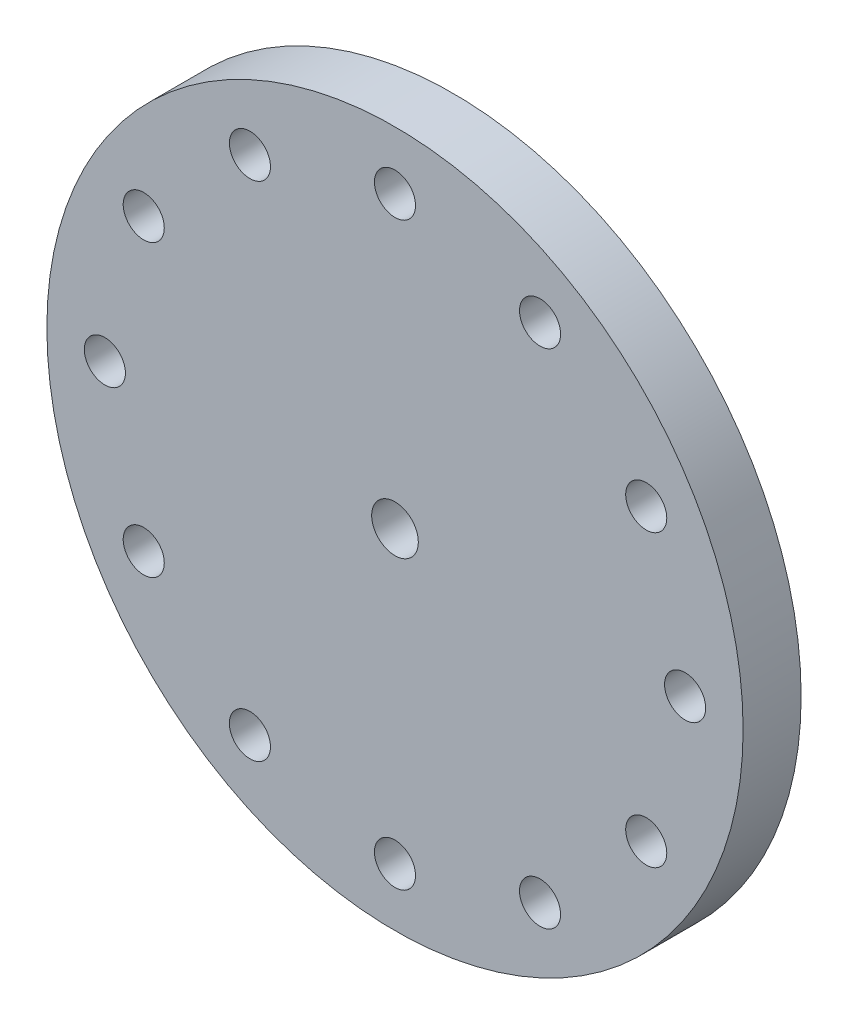
ISO-10303-21;
HEADER;
FILE_DESCRIPTION(('STEP AP214'),'2;1');
FILE_NAME('part.step','',(''),(''),'','','');
FILE_SCHEMA(('AUTOMOTIVE_DESIGN { 1 0 10303 214 1 1 1 1 }'));
ENDSEC;
DATA;
#1=APPLICATION_CONTEXT('core data for automotive mechanical design processes');
#2=APPLICATION_PROTOCOL_DEFINITION('international standard','automotive_design',2000,#1);
#3=PRODUCT_CONTEXT('',#1,'mechanical');
#4=PRODUCT('Part','Part','',(#3));
#5=PRODUCT_RELATED_PRODUCT_CATEGORY('part','',(#4));
#6=PRODUCT_DEFINITION_FORMATION('','',#4);
#7=PRODUCT_DEFINITION_CONTEXT('part definition',#1,'design');
#8=PRODUCT_DEFINITION('design','',#6,#7);
#9=PRODUCT_DEFINITION_SHAPE('','',#8);
#10=(LENGTH_UNIT() NAMED_UNIT(*) SI_UNIT(.MILLI.,.METRE.));
#11=(NAMED_UNIT(*) PLANE_ANGLE_UNIT() SI_UNIT($,.RADIAN.));
#12=(NAMED_UNIT(*) SI_UNIT($,.STERADIAN.) SOLID_ANGLE_UNIT());
#13=UNCERTAINTY_MEASURE_WITH_UNIT(LENGTH_MEASURE(1.E-05),#10,'distance_accuracy_value','');
#14=(GEOMETRIC_REPRESENTATION_CONTEXT(3) GLOBAL_UNCERTAINTY_ASSIGNED_CONTEXT((#13)) GLOBAL_UNIT_ASSIGNED_CONTEXT((#10,
#11,#12)) REPRESENTATION_CONTEXT('',''));
#15=CARTESIAN_POINT('',(0.,0.,0.));
#16=DIRECTION('',(0.,0.,1.));
#17=DIRECTION('',(1.,0.,0.));
#18=AXIS2_PLACEMENT_3D('',#15,#16,#17);
#19=CARTESIAN_POINT('',(0.,0.,6.35));
#20=DIRECTION('',(0.,0.,-1.));
#21=DIRECTION('',(-1.,0.,0.));
#22=AXIS2_PLACEMENT_3D('',#19,#20,#21);
#23=CYLINDRICAL_SURFACE('',#22,38.1);
#24=CARTESIAN_POINT('',(0.,0.,6.35));
#25=DIRECTION('',(0.,0.,1.));
#26=DIRECTION('',(1.,0.,0.));
#27=AXIS2_PLACEMENT_3D('',#24,#25,#26);
#28=CIRCLE('',#27,38.1);
#29=CARTESIAN_POINT('',(38.1,0.,6.35));
#30=VERTEX_POINT('',#29);
#31=EDGE_CURVE('E10',#30,#30,#28,.T.);
#32=ORIENTED_EDGE('',*,*,#31,.F.);
#33=EDGE_LOOP('',(#32));
#34=FACE_BOUND('',#33,.T.);
#35=CARTESIAN_POINT('',(0.,0.,0.));
#36=DIRECTION('',(0.,0.,1.));
#37=DIRECTION('',(1.,0.,0.));
#38=AXIS2_PLACEMENT_3D('',#35,#36,#37);
#39=CIRCLE('',#38,38.1);
#40=CARTESIAN_POINT('',(38.1,0.,0.));
#41=VERTEX_POINT('',#40);
#42=EDGE_CURVE('E48',#41,#41,#39,.T.);
#43=ORIENTED_EDGE('',*,*,#42,.T.);
#44=EDGE_LOOP('',(#43));
#45=FACE_BOUND('',#44,.T.);
#46=ADVANCED_FACE('F41',(#34,#45),#23,.T.);
#47=CARTESIAN_POINT('',(0.,0.,6.35));
#48=DIRECTION('',(0.,0.,1.));
#49=DIRECTION('',(1.,0.,0.));
#50=AXIS2_PLACEMENT_3D('',#47,#48,#49);
#51=PLANE('',#50);
#52=CARTESIAN_POINT('',(-31.75,0.,6.35));
#53=DIRECTION('',(0.,0.,1.));
#54=DIRECTION('',(1.,0.,0.));
#55=AXIS2_PLACEMENT_3D('',#52,#53,#54);
#56=CIRCLE('',#55,2.24789999999996);
#57=CARTESIAN_POINT('',(-29.5021,0.,6.35));
#58=VERTEX_POINT('',#57);
#59=EDGE_CURVE('E162',#58,#58,#56,.T.);
#60=ORIENTED_EDGE('',*,*,#59,.F.);
#61=EDGE_LOOP('',(#60));
#62=FACE_BOUND('',#61,.T.);
#63=CARTESIAN_POINT('',(-27.4963065701559,15.875,6.35));
#64=DIRECTION('',(0.,0.,1.));
#65=DIRECTION('',(1.,0.,0.));
#66=AXIS2_PLACEMENT_3D('',#63,#64,#65);
#67=CIRCLE('',#66,2.24789999999996);
#68=CARTESIAN_POINT('',(-25.2484065701559,15.875,6.35));
#69=VERTEX_POINT('',#68);
#70=EDGE_CURVE('E86',#69,#69,#67,.T.);
#71=ORIENTED_EDGE('',*,*,#70,.F.);
#72=EDGE_LOOP('',(#71));
#73=FACE_BOUND('',#72,.T.);
#74=CARTESIAN_POINT('',(-15.8749999999999,27.496306570156,6.35));
#75=DIRECTION('',(0.,0.,1.));
#76=DIRECTION('',(1.,0.,0.));
#77=AXIS2_PLACEMENT_3D('',#74,#75,#76);
#78=CIRCLE('',#77,2.24789999999996);
#79=CARTESIAN_POINT('',(-13.6271,27.496306570156,6.35));
#80=VERTEX_POINT('',#79);
#81=EDGE_CURVE('E74',#80,#80,#78,.T.);
#82=ORIENTED_EDGE('',*,*,#81,.F.);
#83=EDGE_LOOP('',(#82));
#84=FACE_BOUND('',#83,.T.);
#85=CARTESIAN_POINT('',(1.10854532508269E-13,31.75,6.35));
#86=DIRECTION('',(0.,0.,1.));
#87=DIRECTION('',(1.,0.,0.));
#88=AXIS2_PLACEMENT_3D('',#85,#86,#87);
#89=CIRCLE('',#88,2.24789999999996);
#90=CARTESIAN_POINT('',(2.24790000000007,31.75,6.35));
#91=VERTEX_POINT('',#90);
#92=EDGE_CURVE('E73',#91,#91,#89,.T.);
#93=ORIENTED_EDGE('',*,*,#92,.F.);
#94=EDGE_LOOP('',(#93));
#95=FACE_BOUND('',#94,.T.);
#96=CARTESIAN_POINT('',(15.8750000000001,27.4963065701559,6.35));
#97=DIRECTION('',(0.,0.,1.));
#98=DIRECTION('',(1.,0.,0.));
#99=AXIS2_PLACEMENT_3D('',#96,#97,#98);
#100=CIRCLE('',#99,2.24789999999996);
#101=CARTESIAN_POINT('',(18.1229000000001,27.4963065701559,6.35));
#102=VERTEX_POINT('',#101);
#103=EDGE_CURVE('E70',#102,#102,#100,.T.);
#104=ORIENTED_EDGE('',*,*,#103,.F.);
#105=EDGE_LOOP('',(#104));
#106=FACE_BOUND('',#105,.T.);
#107=CARTESIAN_POINT('',(27.496306570156,15.8749999999998,6.35));
#108=DIRECTION('',(0.,0.,1.));
#109=DIRECTION('',(1.,0.,0.));
#110=AXIS2_PLACEMENT_3D('',#107,#108,#109);
#111=CIRCLE('',#110,2.24789999999996);
#112=CARTESIAN_POINT('',(29.744206570156,15.8749999999998,6.35));
#113=VERTEX_POINT('',#112);
#114=EDGE_CURVE('E67',#113,#113,#111,.T.);
#115=ORIENTED_EDGE('',*,*,#114,.F.);
#116=EDGE_LOOP('',(#115));
#117=FACE_BOUND('',#116,.T.);
#118=CARTESIAN_POINT('',(31.75,-2.21709065016539E-13,6.35));
#119=DIRECTION('',(0.,0.,1.));
#120=DIRECTION('',(1.,0.,0.));
#121=AXIS2_PLACEMENT_3D('',#118,#119,#120);
#122=CIRCLE('',#121,2.24789999999996);
#123=CARTESIAN_POINT('',(33.9979,-2.21709065016539E-13,6.35));
#124=VERTEX_POINT('',#123);
#125=EDGE_CURVE('E66',#124,#124,#122,.T.);
#126=ORIENTED_EDGE('',*,*,#125,.F.);
#127=EDGE_LOOP('',(#126));
#128=FACE_BOUND('',#127,.T.);
#129=CARTESIAN_POINT('',(27.4963065701558,-15.8750000000002,6.35));
#130=DIRECTION('',(0.,0.,1.));
#131=DIRECTION('',(1.,0.,0.));
#132=AXIS2_PLACEMENT_3D('',#129,#130,#131);
#133=CIRCLE('',#132,2.24789999999996);
#134=CARTESIAN_POINT('',(29.7442065701558,-15.8750000000002,6.35));
#135=VERTEX_POINT('',#134);
#136=EDGE_CURVE('E62',#135,#135,#133,.T.);
#137=ORIENTED_EDGE('',*,*,#136,.F.);
#138=EDGE_LOOP('',(#137));
#139=FACE_BOUND('',#138,.T.);
#140=CARTESIAN_POINT('',(15.8749999999997,-27.4963065701561,6.35));
#141=DIRECTION('',(0.,0.,1.));
#142=DIRECTION('',(1.,0.,0.));
#143=AXIS2_PLACEMENT_3D('',#140,#141,#142);
#144=CIRCLE('',#143,2.24789999999996);
#145=CARTESIAN_POINT('',(18.1228999999997,-27.4963065701561,6.35));
#146=VERTEX_POINT('',#145);
#147=EDGE_CURVE('E61',#146,#146,#144,.T.);
#148=ORIENTED_EDGE('',*,*,#147,.F.);
#149=EDGE_LOOP('',(#148));
#150=FACE_BOUND('',#149,.T.);
#151=CARTESIAN_POINT('',(-3.32563597524808E-13,-31.75,6.35));
#152=DIRECTION('',(0.,0.,1.));
#153=DIRECTION('',(1.,0.,0.));
#154=AXIS2_PLACEMENT_3D('',#151,#152,#153);
#155=CIRCLE('',#154,2.24789999999996);
#156=CARTESIAN_POINT('',(2.24789999999963,-31.75,6.35));
#157=VERTEX_POINT('',#156);
#158=EDGE_CURVE('E108',#157,#157,#155,.T.);
#159=ORIENTED_EDGE('',*,*,#158,.F.);
#160=EDGE_LOOP('',(#159));
#161=FACE_BOUND('',#160,.T.);
#162=CARTESIAN_POINT('',(-15.8750000000003,-27.4963065701557,6.35));
#163=DIRECTION('',(0.,0.,1.));
#164=DIRECTION('',(1.,0.,0.));
#165=AXIS2_PLACEMENT_3D('',#162,#163,#164);
#166=CIRCLE('',#165,2.24789999999996);
#167=CARTESIAN_POINT('',(-13.6271000000004,-27.4963065701557,6.35));
#168=VERTEX_POINT('',#167);
#169=EDGE_CURVE('E114',#168,#168,#166,.T.);
#170=ORIENTED_EDGE('',*,*,#169,.F.);
#171=EDGE_LOOP('',(#170));
#172=FACE_BOUND('',#171,.T.);
#173=CARTESIAN_POINT('',(-27.4963065701561,-15.8749999999996,6.35));
#174=DIRECTION('',(0.,0.,1.));
#175=DIRECTION('',(1.,0.,0.));
#176=AXIS2_PLACEMENT_3D('',#173,#174,#175);
#177=CIRCLE('',#176,2.24789999999996);
#178=CARTESIAN_POINT('',(-25.2484065701562,-15.8749999999996,6.35));
#179=VERTEX_POINT('',#178);
#180=EDGE_CURVE('E120',#179,#179,#177,.T.);
#181=ORIENTED_EDGE('',*,*,#180,.F.);
#182=EDGE_LOOP('',(#181));
#183=FACE_BOUND('',#182,.T.);
#184=CARTESIAN_POINT('',(0.,0.,6.35));
#185=DIRECTION('',(0.,0.,1.));
#186=DIRECTION('',(1.,0.,0.));
#187=AXIS2_PLACEMENT_3D('',#184,#185,#186);
#188=CIRCLE('',#187,2.55269999999999);
#189=CARTESIAN_POINT('',(2.55269999999999,0.,6.35));
#190=VERTEX_POINT('',#189);
#191=EDGE_CURVE('E125',#190,#190,#188,.T.);
#192=ORIENTED_EDGE('',*,*,#191,.F.);
#193=EDGE_LOOP('',(#192));
#194=FACE_BOUND('',#193,.T.);
#195=ORIENTED_EDGE('',*,*,#31,.T.);
#196=EDGE_LOOP('',(#195));
#197=FACE_BOUND('',#196,.T.);
#198=ADVANCED_FACE('F146',(#62,#73,#84,#95,#106,#117,#128,#139,#150,#161,#172,#183,#194,#197),
#51,.T.);
#199=CARTESIAN_POINT('',(0.,0.,0.));
#200=DIRECTION('',(0.,0.,1.));
#201=DIRECTION('',(1.,0.,0.));
#202=AXIS2_PLACEMENT_3D('',#199,#200,#201);
#203=PLANE('',#202);
#204=CARTESIAN_POINT('',(-31.75,0.,0.));
#205=DIRECTION('',(0.,0.,1.));
#206=DIRECTION('',(1.,0.,0.));
#207=AXIS2_PLACEMENT_3D('',#204,#205,#206);
#208=CIRCLE('',#207,2.24789999999994);
#209=CARTESIAN_POINT('',(-29.5021000000001,0.,0.));
#210=VERTEX_POINT('',#209);
#211=EDGE_CURVE('E44',#210,#210,#208,.T.);
#212=ORIENTED_EDGE('',*,*,#211,.T.);
#213=EDGE_LOOP('',(#212));
#214=FACE_BOUND('',#213,.T.);
#215=CARTESIAN_POINT('',(-27.4963065701559,15.875,0.));
#216=DIRECTION('',(0.,0.,1.));
#217=DIRECTION('',(1.,0.,0.));
#218=AXIS2_PLACEMENT_3D('',#215,#216,#217);
#219=CIRCLE('',#218,2.24789999999994);
#220=CARTESIAN_POINT('',(-25.248406570156,15.875,0.));
#221=VERTEX_POINT('',#220);
#222=EDGE_CURVE('E81',#221,#221,#219,.T.);
#223=ORIENTED_EDGE('',*,*,#222,.T.);
#224=EDGE_LOOP('',(#223));
#225=FACE_BOUND('',#224,.T.);
#226=CARTESIAN_POINT('',(-15.8749999999999,27.496306570156,0.));
#227=DIRECTION('',(0.,0.,1.));
#228=DIRECTION('',(1.,0.,0.));
#229=AXIS2_PLACEMENT_3D('',#226,#227,#228);
#230=CIRCLE('',#229,2.24789999999994);
#231=CARTESIAN_POINT('',(-13.6271,27.496306570156,0.));
#232=VERTEX_POINT('',#231);
#233=EDGE_CURVE('E71',#232,#232,#230,.T.);
#234=ORIENTED_EDGE('',*,*,#233,.T.);
#235=EDGE_LOOP('',(#234));
#236=FACE_BOUND('',#235,.T.);
#237=CARTESIAN_POINT('',(1.10854532508269E-13,31.75,0.));
#238=DIRECTION('',(0.,0.,1.));
#239=DIRECTION('',(1.,0.,0.));
#240=AXIS2_PLACEMENT_3D('',#237,#238,#239);
#241=CIRCLE('',#240,2.24789999999994);
#242=CARTESIAN_POINT('',(2.24790000000005,31.75,0.));
#243=VERTEX_POINT('',#242);
#244=EDGE_CURVE('E78',#243,#243,#241,.T.);
#245=ORIENTED_EDGE('',*,*,#244,.T.);
#246=EDGE_LOOP('',(#245));
#247=FACE_BOUND('',#246,.T.);
#248=CARTESIAN_POINT('',(15.8750000000001,27.4963065701559,0.));
#249=DIRECTION('',(0.,0.,1.));
#250=DIRECTION('',(1.,0.,0.));
#251=AXIS2_PLACEMENT_3D('',#248,#249,#250);
#252=CIRCLE('',#251,2.24789999999994);
#253=CARTESIAN_POINT('',(18.1229000000001,27.4963065701559,0.));
#254=VERTEX_POINT('',#253);
#255=EDGE_CURVE('E68',#254,#254,#252,.T.);
#256=ORIENTED_EDGE('',*,*,#255,.T.);
#257=EDGE_LOOP('',(#256));
#258=FACE_BOUND('',#257,.T.);
#259=CARTESIAN_POINT('',(27.496306570156,15.8749999999998,0.));
#260=DIRECTION('',(0.,0.,1.));
#261=DIRECTION('',(1.,0.,0.));
#262=AXIS2_PLACEMENT_3D('',#259,#260,#261);
#263=CIRCLE('',#262,2.24789999999994);
#264=CARTESIAN_POINT('',(29.744206570156,15.8749999999998,0.));
#265=VERTEX_POINT('',#264);
#266=EDGE_CURVE('E63',#265,#265,#263,.T.);
#267=ORIENTED_EDGE('',*,*,#266,.T.);
#268=EDGE_LOOP('',(#267));
#269=FACE_BOUND('',#268,.T.);
#270=CARTESIAN_POINT('',(31.75,-2.21709065016539E-13,0.));
#271=DIRECTION('',(0.,0.,1.));
#272=DIRECTION('',(1.,0.,0.));
#273=AXIS2_PLACEMENT_3D('',#270,#271,#272);
#274=CIRCLE('',#273,2.24789999999994);
#275=CARTESIAN_POINT('',(33.9978999999999,-2.21709065016539E-13,0.));
#276=VERTEX_POINT('',#275);
#277=EDGE_CURVE('E98',#276,#276,#274,.T.);
#278=ORIENTED_EDGE('',*,*,#277,.T.);
#279=EDGE_LOOP('',(#278));
#280=FACE_BOUND('',#279,.T.);
#281=CARTESIAN_POINT('',(27.4963065701558,-15.8750000000002,0.));
#282=DIRECTION('',(0.,0.,1.));
#283=DIRECTION('',(1.,0.,0.));
#284=AXIS2_PLACEMENT_3D('',#281,#282,#283);
#285=CIRCLE('',#284,2.24789999999994);
#286=CARTESIAN_POINT('',(29.7442065701557,-15.8750000000002,0.));
#287=VERTEX_POINT('',#286);
#288=EDGE_CURVE('E58',#287,#287,#285,.T.);
#289=ORIENTED_EDGE('',*,*,#288,.T.);
#290=EDGE_LOOP('',(#289));
#291=FACE_BOUND('',#290,.T.);
#292=CARTESIAN_POINT('',(15.8749999999997,-27.4963065701561,0.));
#293=DIRECTION('',(0.,0.,1.));
#294=DIRECTION('',(1.,0.,0.));
#295=AXIS2_PLACEMENT_3D('',#292,#293,#294);
#296=CIRCLE('',#295,2.24789999999994);
#297=CARTESIAN_POINT('',(18.1228999999997,-27.4963065701561,0.));
#298=VERTEX_POINT('',#297);
#299=EDGE_CURVE('E105',#298,#298,#296,.T.);
#300=ORIENTED_EDGE('',*,*,#299,.T.);
#301=EDGE_LOOP('',(#300));
#302=FACE_BOUND('',#301,.T.);
#303=CARTESIAN_POINT('',(-3.32563597524808E-13,-31.75,0.));
#304=DIRECTION('',(0.,0.,1.));
#305=DIRECTION('',(1.,0.,0.));
#306=AXIS2_PLACEMENT_3D('',#303,#304,#305);
#307=CIRCLE('',#306,2.24789999999994);
#308=CARTESIAN_POINT('',(2.24789999999961,-31.75,0.));
#309=VERTEX_POINT('',#308);
#310=EDGE_CURVE('E111',#309,#309,#307,.T.);
#311=ORIENTED_EDGE('',*,*,#310,.T.);
#312=EDGE_LOOP('',(#311));
#313=FACE_BOUND('',#312,.T.);
#314=CARTESIAN_POINT('',(-15.8750000000003,-27.4963065701557,0.));
#315=DIRECTION('',(0.,0.,1.));
#316=DIRECTION('',(1.,0.,0.));
#317=AXIS2_PLACEMENT_3D('',#314,#315,#316);
#318=CIRCLE('',#317,2.24789999999994);
#319=CARTESIAN_POINT('',(-13.6271000000004,-27.4963065701557,0.));
#320=VERTEX_POINT('',#319);
#321=EDGE_CURVE('E117',#320,#320,#318,.T.);
#322=ORIENTED_EDGE('',*,*,#321,.T.);
#323=EDGE_LOOP('',(#322));
#324=FACE_BOUND('',#323,.T.);
#325=CARTESIAN_POINT('',(-27.4963065701561,-15.8749999999996,0.));
#326=DIRECTION('',(0.,0.,1.));
#327=DIRECTION('',(1.,0.,0.));
#328=AXIS2_PLACEMENT_3D('',#325,#326,#327);
#329=CIRCLE('',#328,2.24789999999994);
#330=CARTESIAN_POINT('',(-25.2484065701562,-15.8749999999996,0.));
#331=VERTEX_POINT('',#330);
#332=EDGE_CURVE('E123',#331,#331,#329,.T.);
#333=ORIENTED_EDGE('',*,*,#332,.T.);
#334=EDGE_LOOP('',(#333));
#335=FACE_BOUND('',#334,.T.);
#336=CARTESIAN_POINT('',(0.,0.,0.));
#337=DIRECTION('',(0.,0.,1.));
#338=DIRECTION('',(1.,0.,0.));
#339=AXIS2_PLACEMENT_3D('',#336,#337,#338);
#340=CIRCLE('',#339,2.5527);
#341=CARTESIAN_POINT('',(2.5527,0.,0.));
#342=VERTEX_POINT('',#341);
#343=EDGE_CURVE('E53',#342,#342,#340,.T.);
#344=ORIENTED_EDGE('',*,*,#343,.T.);
#345=EDGE_LOOP('',(#344));
#346=FACE_BOUND('',#345,.T.);
#347=ORIENTED_EDGE('',*,*,#42,.F.);
#348=EDGE_LOOP('',(#347));
#349=FACE_BOUND('',#348,.T.);
#350=ADVANCED_FACE('F132',(#214,#225,#236,#247,#258,#269,#280,#291,#302,#313,#324,#335,#346,
#349),#203,.F.);
#351=CARTESIAN_POINT('',(0.,0.,6.35));
#352=DIRECTION('',(0.,0.,1.));
#353=DIRECTION('',(1.,0.,0.));
#354=AXIS2_PLACEMENT_3D('',#351,#352,#353);
#355=CYLINDRICAL_SURFACE('',#354,2.55269999999999);
#356=ORIENTED_EDGE('',*,*,#343,.F.);
#357=EDGE_LOOP('',(#356));
#358=FACE_BOUND('',#357,.T.);
#359=ORIENTED_EDGE('',*,*,#191,.T.);
#360=EDGE_LOOP('',(#359));
#361=FACE_BOUND('',#360,.T.);
#362=ADVANCED_FACE('F135',(#358,#361),#355,.F.);
#363=CARTESIAN_POINT('',(-27.4963065701561,-15.8749999999996,6.35));
#364=DIRECTION('',(0.,0.,1.));
#365=DIRECTION('',(1.,0.,0.));
#366=AXIS2_PLACEMENT_3D('',#363,#364,#365);
#367=CYLINDRICAL_SURFACE('',#366,2.24789999999994);
#368=ORIENTED_EDGE('',*,*,#180,.T.);
#369=EDGE_LOOP('',(#368));
#370=FACE_BOUND('',#369,.T.);
#371=ORIENTED_EDGE('',*,*,#332,.F.);
#372=EDGE_LOOP('',(#371));
#373=FACE_BOUND('',#372,.T.);
#374=ADVANCED_FACE('F137',(#370,#373),#367,.F.);
#375=CARTESIAN_POINT('',(-15.8750000000003,-27.4963065701557,6.35));
#376=DIRECTION('',(0.,0.,1.));
#377=DIRECTION('',(1.,0.,0.));
#378=AXIS2_PLACEMENT_3D('',#375,#376,#377);
#379=CYLINDRICAL_SURFACE('',#378,2.24789999999994);
#380=ORIENTED_EDGE('',*,*,#169,.T.);
#381=EDGE_LOOP('',(#380));
#382=FACE_BOUND('',#381,.T.);
#383=ORIENTED_EDGE('',*,*,#321,.F.);
#384=EDGE_LOOP('',(#383));
#385=FACE_BOUND('',#384,.T.);
#386=ADVANCED_FACE('F143',(#382,#385),#379,.F.);
#387=CARTESIAN_POINT('',(-3.32563597524808E-13,-31.75,6.35));
#388=DIRECTION('',(0.,0.,1.));
#389=DIRECTION('',(1.,0.,0.));
#390=AXIS2_PLACEMENT_3D('',#387,#388,#389);
#391=CYLINDRICAL_SURFACE('',#390,2.24789999999994);
#392=ORIENTED_EDGE('',*,*,#158,.T.);
#393=EDGE_LOOP('',(#392));
#394=FACE_BOUND('',#393,.T.);
#395=ORIENTED_EDGE('',*,*,#310,.F.);
#396=EDGE_LOOP('',(#395));
#397=FACE_BOUND('',#396,.T.);
#398=ADVANCED_FACE('F191',(#394,#397),#391,.F.);
#399=CARTESIAN_POINT('',(15.8749999999997,-27.4963065701561,6.35));
#400=DIRECTION('',(0.,0.,1.));
#401=DIRECTION('',(1.,0.,0.));
#402=AXIS2_PLACEMENT_3D('',#399,#400,#401);
#403=CYLINDRICAL_SURFACE('',#402,2.24789999999994);
#404=ORIENTED_EDGE('',*,*,#147,.T.);
#405=EDGE_LOOP('',(#404));
#406=FACE_BOUND('',#405,.T.);
#407=ORIENTED_EDGE('',*,*,#299,.F.);
#408=EDGE_LOOP('',(#407));
#409=FACE_BOUND('',#408,.T.);
#410=ADVANCED_FACE('F198',(#406,#409),#403,.F.);
#411=CARTESIAN_POINT('',(27.4963065701558,-15.8750000000002,6.35));
#412=DIRECTION('',(0.,0.,1.));
#413=DIRECTION('',(1.,0.,0.));
#414=AXIS2_PLACEMENT_3D('',#411,#412,#413);
#415=CYLINDRICAL_SURFACE('',#414,2.24789999999994);
#416=ORIENTED_EDGE('',*,*,#136,.T.);
#417=EDGE_LOOP('',(#416));
#418=FACE_BOUND('',#417,.T.);
#419=ORIENTED_EDGE('',*,*,#288,.F.);
#420=EDGE_LOOP('',(#419));
#421=FACE_BOUND('',#420,.T.);
#422=ADVANCED_FACE('F204',(#418,#421),#415,.F.);
#423=CARTESIAN_POINT('',(31.75,-2.21709065016539E-13,6.35));
#424=DIRECTION('',(0.,0.,1.));
#425=DIRECTION('',(1.,0.,0.));
#426=AXIS2_PLACEMENT_3D('',#423,#424,#425);
#427=CYLINDRICAL_SURFACE('',#426,2.24789999999994);
#428=ORIENTED_EDGE('',*,*,#125,.T.);
#429=EDGE_LOOP('',(#428));
#430=FACE_BOUND('',#429,.T.);
#431=ORIENTED_EDGE('',*,*,#277,.F.);
#432=EDGE_LOOP('',(#431));
#433=FACE_BOUND('',#432,.T.);
#434=ADVANCED_FACE('F208',(#430,#433),#427,.F.);
#435=CARTESIAN_POINT('',(27.496306570156,15.8749999999998,6.35));
#436=DIRECTION('',(0.,0.,1.));
#437=DIRECTION('',(1.,0.,0.));
#438=AXIS2_PLACEMENT_3D('',#435,#436,#437);
#439=CYLINDRICAL_SURFACE('',#438,2.24789999999994);
#440=ORIENTED_EDGE('',*,*,#114,.T.);
#441=EDGE_LOOP('',(#440));
#442=FACE_BOUND('',#441,.T.);
#443=ORIENTED_EDGE('',*,*,#266,.F.);
#444=EDGE_LOOP('',(#443));
#445=FACE_BOUND('',#444,.T.);
#446=ADVANCED_FACE('F212',(#442,#445),#439,.F.);
#447=CARTESIAN_POINT('',(15.8750000000001,27.4963065701559,6.35));
#448=DIRECTION('',(0.,0.,1.));
#449=DIRECTION('',(1.,0.,0.));
#450=AXIS2_PLACEMENT_3D('',#447,#448,#449);
#451=CYLINDRICAL_SURFACE('',#450,2.24789999999994);
#452=ORIENTED_EDGE('',*,*,#103,.T.);
#453=EDGE_LOOP('',(#452));
#454=FACE_BOUND('',#453,.T.);
#455=ORIENTED_EDGE('',*,*,#255,.F.);
#456=EDGE_LOOP('',(#455));
#457=FACE_BOUND('',#456,.T.);
#458=ADVANCED_FACE('F216',(#454,#457),#451,.F.);
#459=CARTESIAN_POINT('',(1.10854532508269E-13,31.75,6.35));
#460=DIRECTION('',(0.,0.,1.));
#461=DIRECTION('',(1.,0.,0.));
#462=AXIS2_PLACEMENT_3D('',#459,#460,#461);
#463=CYLINDRICAL_SURFACE('',#462,2.24789999999994);
#464=ORIENTED_EDGE('',*,*,#92,.T.);
#465=EDGE_LOOP('',(#464));
#466=FACE_BOUND('',#465,.T.);
#467=ORIENTED_EDGE('',*,*,#244,.F.);
#468=EDGE_LOOP('',(#467));
#469=FACE_BOUND('',#468,.T.);
#470=ADVANCED_FACE('F220',(#466,#469),#463,.F.);
#471=CARTESIAN_POINT('',(-15.8749999999999,27.496306570156,6.35));
#472=DIRECTION('',(0.,0.,1.));
#473=DIRECTION('',(1.,0.,0.));
#474=AXIS2_PLACEMENT_3D('',#471,#472,#473);
#475=CYLINDRICAL_SURFACE('',#474,2.24789999999994);
#476=ORIENTED_EDGE('',*,*,#81,.T.);
#477=EDGE_LOOP('',(#476));
#478=FACE_BOUND('',#477,.T.);
#479=ORIENTED_EDGE('',*,*,#233,.F.);
#480=EDGE_LOOP('',(#479));
#481=FACE_BOUND('',#480,.T.);
#482=ADVANCED_FACE('F224',(#478,#481),#475,.F.);
#483=CARTESIAN_POINT('',(-27.4963065701559,15.875,6.35));
#484=DIRECTION('',(0.,0.,1.));
#485=DIRECTION('',(1.,0.,0.));
#486=AXIS2_PLACEMENT_3D('',#483,#484,#485);
#487=CYLINDRICAL_SURFACE('',#486,2.24789999999994);
#488=ORIENTED_EDGE('',*,*,#70,.T.);
#489=EDGE_LOOP('',(#488));
#490=FACE_BOUND('',#489,.T.);
#491=ORIENTED_EDGE('',*,*,#222,.F.);
#492=EDGE_LOOP('',(#491));
#493=FACE_BOUND('',#492,.T.);
#494=ADVANCED_FACE('F228',(#490,#493),#487,.F.);
#495=CARTESIAN_POINT('',(-31.75,0.,6.35));
#496=DIRECTION('',(0.,0.,1.));
#497=DIRECTION('',(1.,0.,0.));
#498=AXIS2_PLACEMENT_3D('',#495,#496,#497);
#499=CYLINDRICAL_SURFACE('',#498,2.24789999999994);
#500=ORIENTED_EDGE('',*,*,#59,.T.);
#501=EDGE_LOOP('',(#500));
#502=FACE_BOUND('',#501,.T.);
#503=ORIENTED_EDGE('',*,*,#211,.F.);
#504=EDGE_LOOP('',(#503));
#505=FACE_BOUND('',#504,.T.);
#506=ADVANCED_FACE('F231',(#502,#505),#499,.F.);
#507=CLOSED_SHELL('',(#46,#198,#350,#362,#374,#386,#398,#410,#422,#434,#446,#458,#470,#482,#494,#506));
#508=MANIFOLD_SOLID_BREP('B2',#507);
#509=ADVANCED_BREP_SHAPE_REPRESENTATION('',(#18,#508),#14);
#510=SHAPE_DEFINITION_REPRESENTATION(#9,#509);
ENDSEC;
END-ISO-10303-21;
